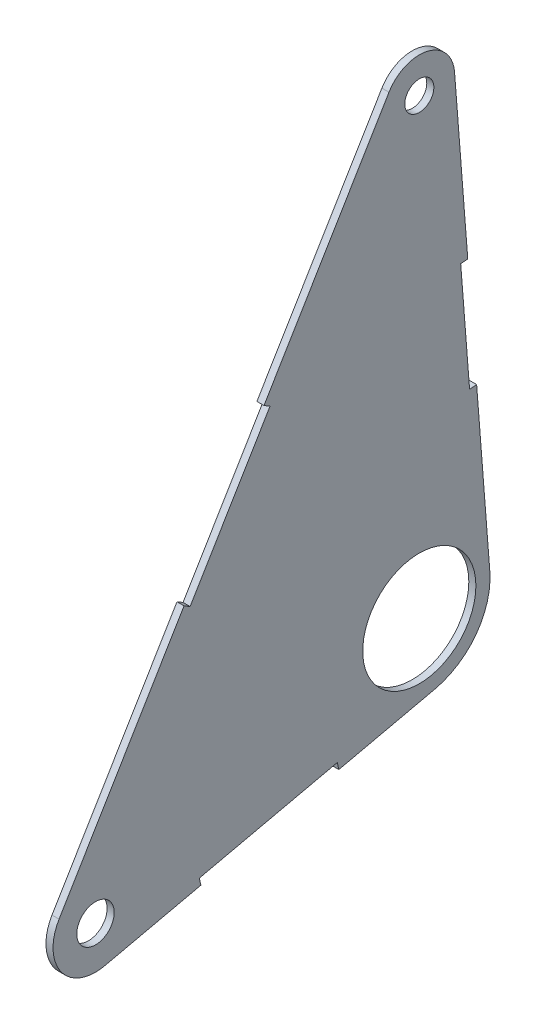
ISO-10303-21;
HEADER;
FILE_DESCRIPTION(('STEP AP214'),'2;1');
FILE_NAME('part.step','',(''),(''),'','','');
FILE_SCHEMA(('AUTOMOTIVE_DESIGN { 1 0 10303 214 1 1 1 1 }'));
ENDSEC;
DATA;
#1=APPLICATION_CONTEXT('core data for automotive mechanical design processes');
#2=APPLICATION_PROTOCOL_DEFINITION('international standard','automotive_design',2000,#1);
#3=PRODUCT_CONTEXT('',#1,'mechanical');
#4=PRODUCT('Part','Part','',(#3));
#5=PRODUCT_RELATED_PRODUCT_CATEGORY('part','',(#4));
#6=PRODUCT_DEFINITION_FORMATION('','',#4);
#7=PRODUCT_DEFINITION_CONTEXT('part definition',#1,'design');
#8=PRODUCT_DEFINITION('design','',#6,#7);
#9=PRODUCT_DEFINITION_SHAPE('','',#8);
#10=(LENGTH_UNIT() NAMED_UNIT(*) SI_UNIT(.MILLI.,.METRE.));
#11=(NAMED_UNIT(*) PLANE_ANGLE_UNIT() SI_UNIT($,.RADIAN.));
#12=(NAMED_UNIT(*) SI_UNIT($,.STERADIAN.) SOLID_ANGLE_UNIT());
#13=UNCERTAINTY_MEASURE_WITH_UNIT(LENGTH_MEASURE(1.E-05),#10,'distance_accuracy_value','');
#14=(GEOMETRIC_REPRESENTATION_CONTEXT(3) GLOBAL_UNCERTAINTY_ASSIGNED_CONTEXT((#13)) GLOBAL_UNIT_ASSIGNED_CONTEXT((#10,
#11,#12)) REPRESENTATION_CONTEXT('',''));
#15=CARTESIAN_POINT('',(0.,0.,0.));
#16=DIRECTION('',(0.,0.,1.));
#17=DIRECTION('',(1.,0.,0.));
#18=AXIS2_PLACEMENT_3D('',#15,#16,#17);
#19=CARTESIAN_POINT('',(1.5875,101.6,0.));
#20=DIRECTION('',(-1.,0.,0.));
#21=DIRECTION('',(0.,0.,1.));
#22=AXIS2_PLACEMENT_3D('',#19,#20,#21);
#23=CYLINDRICAL_SURFACE('',#22,7.93750000000001);
#24=CARTESIAN_POINT('',(0.,101.6,0.));
#25=DIRECTION('',(1.,0.,0.));
#26=DIRECTION('',(0.,0.,-1.));
#27=AXIS2_PLACEMENT_3D('',#24,#25,#26);
#28=CIRCLE('',#27,7.93750000000001);
#29=CARTESIAN_POINT('',(0.,105.676370045191,6.81080857935887));
#30=VERTEX_POINT('',#29);
#31=CARTESIAN_POINT('',(0.,102.2201171875,-7.9132395972678));
#32=VERTEX_POINT('',#31);
#33=EDGE_CURVE('E259',#30,#32,#28,.F.);
#34=ORIENTED_EDGE('',*,*,#33,.F.);
#35=DIRECTION('',(-1.,0.,0.));
#36=VECTOR('',#35,1.);
#37=CARTESIAN_POINT('',(1.5875,105.676370045191,6.81080857935887));
#38=LINE('',#37,#36);
#39=CARTESIAN_POINT('',(1.5875,105.676370045191,6.81080857935887));
#40=VERTEX_POINT('',#39);
#41=EDGE_CURVE('E11',#40,#30,#38,.T.);
#42=ORIENTED_EDGE('',*,*,#41,.F.);
#43=CARTESIAN_POINT('',(1.5875,101.6,0.));
#44=DIRECTION('',(1.,0.,0.));
#45=DIRECTION('',(0.,0.,-1.));
#46=AXIS2_PLACEMENT_3D('',#43,#44,#45);
#47=CIRCLE('',#46,7.93750000000001);
#48=CARTESIAN_POINT('',(1.5875,102.2201171875,-7.9132395972678));
#49=VERTEX_POINT('',#48);
#50=EDGE_CURVE('E368',#40,#49,#47,.F.);
#51=ORIENTED_EDGE('',*,*,#50,.T.);
#52=DIRECTION('',(-1.,0.,0.));
#53=VECTOR('',#52,1.);
#54=CARTESIAN_POINT('',(1.5875,102.2201171875,-7.9132395972678));
#55=LINE('',#54,#53);
#56=EDGE_CURVE('E58',#49,#32,#55,.T.);
#57=ORIENTED_EDGE('',*,*,#56,.T.);
#58=EDGE_LOOP('',(#34,#42,#51,#57));
#59=FACE_BOUND('',#58,.T.);
#60=ADVANCED_FACE('F40',(#59),#23,.T.);
#61=CARTESIAN_POINT('',(1.5875,30.8725838581353,51.5819851183567));
#62=DIRECTION('',(0.,0.513558430890221,0.858054624171197));
#63=DIRECTION('',(0.,-0.858054624171197,0.513558430890222));
#64=AXIS2_PLACEMENT_3D('',#61,#62,#63);
#65=PLANE('',#64);
#66=DIRECTION('',(0.,0.858054624171197,-0.513558430890222));
#67=VECTOR('',#66,1.);
#68=CARTESIAN_POINT('',(0.,30.8725838581353,51.5819851183567));
#69=LINE('',#68,#67);
#70=CARTESIAN_POINT('',(0.,58.8108949631868,34.8604911613817));
#71=VERTEX_POINT('',#70);
#72=EDGE_CURVE('E255',#71,#30,#69,.T.);
#73=ORIENTED_EDGE('',*,*,#72,.F.);
#74=DIRECTION('',(-1.,0.,0.));
#75=VECTOR('',#74,1.);
#76=CARTESIAN_POINT('',(1.5875,58.8108949631868,34.8604911613817));
#77=LINE('',#76,#75);
#78=CARTESIAN_POINT('',(1.5875,58.8108949631868,34.8604911613817));
#79=VERTEX_POINT('',#78);
#80=EDGE_CURVE('E50',#79,#71,#77,.T.);
#81=ORIENTED_EDGE('',*,*,#80,.F.);
#82=DIRECTION('',(0.,0.858054624171197,-0.513558430890222));
#83=VECTOR('',#82,1.);
#84=CARTESIAN_POINT('',(1.5875,30.8725838581353,51.5819851183567));
#85=LINE('',#84,#83);
#86=EDGE_CURVE('E365',#79,#40,#85,.T.);
#87=ORIENTED_EDGE('',*,*,#86,.T.);
#88=ORIENTED_EDGE('',*,*,#41,.T.);
#89=EDGE_LOOP('',(#73,#81,#87,#88));
#90=FACE_BOUND('',#89,.T.);
#91=ADVANCED_FACE('F256',(#90),#65,.T.);
#92=CARTESIAN_POINT('',(1.5875,27.9383111050524,-16.721493956975));
#93=DIRECTION('',(0.,-0.858054624171203,0.51355843089021));
#94=DIRECTION('',(0.,-0.51355843089021,-0.858054624171203));
#95=AXIS2_PLACEMENT_3D('',#92,#93,#94);
#96=PLANE('',#95);
#97=DIRECTION('',(0.,0.51355843089021,0.858054624171203));
#98=VECTOR('',#97,1.);
#99=CARTESIAN_POINT('',(0.,27.9383111050524,-16.721493956975));
#100=LINE('',#99,#98);
#101=CARTESIAN_POINT('',(0.,57.9956209541486,33.4983294455099));
#102=VERTEX_POINT('',#101);
#103=EDGE_CURVE('E247',#102,#71,#100,.T.);
#104=ORIENTED_EDGE('',*,*,#103,.F.);
#105=DIRECTION('',(-1.,0.,0.));
#106=VECTOR('',#105,1.);
#107=CARTESIAN_POINT('',(1.5875,57.9956209541486,33.4983294455099));
#108=LINE('',#107,#106);
#109=CARTESIAN_POINT('',(1.5875,57.9956209541486,33.4983294455099));
#110=VERTEX_POINT('',#109);
#111=EDGE_CURVE('E237',#110,#102,#108,.T.);
#112=ORIENTED_EDGE('',*,*,#111,.F.);
#113=DIRECTION('',(0.,0.51355843089021,0.858054624171203));
#114=VECTOR('',#113,1.);
#115=CARTESIAN_POINT('',(1.5875,27.9383111050524,-16.721493956975));
#116=LINE('',#115,#114);
#117=EDGE_CURVE('E250',#110,#79,#116,.T.);
#118=ORIENTED_EDGE('',*,*,#117,.T.);
#119=ORIENTED_EDGE('',*,*,#80,.T.);
#120=EDGE_LOOP('',(#104,#112,#118,#119));
#121=FACE_BOUND('',#120,.T.);
#122=ADVANCED_FACE('F245',(#121),#96,.T.);
#123=CARTESIAN_POINT('',(1.5875,30.057309849097,50.2198234024849));
#124=DIRECTION('',(0.,0.513558430890221,0.858054624171197));
#125=DIRECTION('',(0.,-0.858054624171197,0.513558430890221));
#126=AXIS2_PLACEMENT_3D('',#123,#124,#125);
#127=PLANE('',#126);
#128=DIRECTION('',(0.,0.858054624171197,-0.513558430890221));
#129=VECTOR('',#128,1.);
#130=CARTESIAN_POINT('',(0.,30.057309849097,50.2198234024849));
#131=LINE('',#130,#129);
#132=CARTESIAN_POINT('',(0.,28.0280632049695,51.4343576443509));
#133=VERTEX_POINT('',#132);
#134=EDGE_CURVE('E265',#133,#102,#131,.T.);
#135=ORIENTED_EDGE('',*,*,#134,.F.);
#136=DIRECTION('',(-1.,0.,0.));
#137=VECTOR('',#136,1.);
#138=CARTESIAN_POINT('',(1.5875,28.0280632049695,51.4343576443509));
#139=LINE('',#138,#137);
#140=CARTESIAN_POINT('',(1.5875,28.0280632049695,51.4343576443509));
#141=VERTEX_POINT('',#140);
#142=EDGE_CURVE('E234',#141,#133,#139,.T.);
#143=ORIENTED_EDGE('',*,*,#142,.F.);
#144=DIRECTION('',(0.,0.858054624171197,-0.513558430890221));
#145=VECTOR('',#144,1.);
#146=CARTESIAN_POINT('',(1.5875,30.057309849097,50.2198234024849));
#147=LINE('',#146,#145);
#148=EDGE_CURVE('E359',#141,#110,#147,.T.);
#149=ORIENTED_EDGE('',*,*,#148,.T.);
#150=ORIENTED_EDGE('',*,*,#111,.T.);
#151=EDGE_LOOP('',(#135,#143,#149,#150));
#152=FACE_BOUND('',#151,.T.);
#153=ADVANCED_FACE('F449',(#152),#127,.T.);
#154=CARTESIAN_POINT('',(1.5875,-2.02924664412764,1.21453424186608));
#155=DIRECTION('',(0.,-0.858054624171195,0.513558430890224));
#156=DIRECTION('',(0.,-0.513558430890224,-0.858054624171195));
#157=AXIS2_PLACEMENT_3D('',#154,#155,#156);
#158=PLANE('',#157);
#159=DIRECTION('',(0.,0.513558430890224,0.858054624171195));
#160=VECTOR('',#159,1.);
#161=CARTESIAN_POINT('',(0.,-2.02924664412764,1.21453424186608));
#162=LINE('',#161,#160);
#163=CARTESIAN_POINT('',(0.,28.8433372140078,52.7965193602226));
#164=VERTEX_POINT('',#163);
#165=EDGE_CURVE('E270',#133,#164,#162,.T.);
#166=ORIENTED_EDGE('',*,*,#165,.T.);
#167=DIRECTION('',(-1.,0.,0.));
#168=VECTOR('',#167,1.);
#169=CARTESIAN_POINT('',(1.5875,28.8433372140078,52.7965193602226));
#170=LINE('',#169,#168);
#171=CARTESIAN_POINT('',(1.5875,28.8433372140078,52.7965193602226));
#172=VERTEX_POINT('',#171);
#173=EDGE_CURVE('E231',#172,#164,#170,.T.);
#174=ORIENTED_EDGE('',*,*,#173,.F.);
#175=DIRECTION('',(0.,0.513558430890224,0.858054624171195));
#176=VECTOR('',#175,1.);
#177=CARTESIAN_POINT('',(1.5875,-2.02924664412764,1.21453424186608));
#178=LINE('',#177,#176);
#179=EDGE_CURVE('E356',#141,#172,#178,.T.);
#180=ORIENTED_EDGE('',*,*,#179,.F.);
#181=ORIENTED_EDGE('',*,*,#142,.T.);
#182=EDGE_LOOP('',(#166,#174,#180,#181));
#183=FACE_BOUND('',#182,.T.);
#184=ADVANCED_FACE('F446',(#183),#158,.F.);
#185=CARTESIAN_POINT('',(0.,-18.0221378679966,80.8462019422454));
#186=VERTEX_POINT('',#185);
#187=EDGE_CURVE('E261',#186,#164,#69,.T.);
#188=ORIENTED_EDGE('',*,*,#187,.F.);
#189=DIRECTION('',(-1.,0.,0.));
#190=VECTOR('',#189,1.);
#191=CARTESIAN_POINT('',(1.5875,-18.0221378679966,80.8462019422454));
#192=LINE('',#191,#190);
#193=CARTESIAN_POINT('',(1.5875,-18.0221378679966,80.8462019422454));
#194=VERTEX_POINT('',#193);
#195=EDGE_CURVE('E228',#194,#186,#192,.T.);
#196=ORIENTED_EDGE('',*,*,#195,.F.);
#197=EDGE_CURVE('E355',#194,#172,#85,.T.);
#198=ORIENTED_EDGE('',*,*,#197,.T.);
#199=ORIENTED_EDGE('',*,*,#173,.T.);
#200=EDGE_LOOP('',(#188,#196,#198,#199));
#201=FACE_BOUND('',#200,.T.);
#202=ADVANCED_FACE('F440',(#201),#65,.T.);
#203=CARTESIAN_POINT('',(1.5875,-22.9137819222259,72.6732316470148));
#204=DIRECTION('',(-1.,0.,0.));
#205=DIRECTION('',(0.,0.,1.));
#206=AXIS2_PLACEMENT_3D('',#203,#204,#205);
#207=CYLINDRICAL_SURFACE('',#206,9.52499999999999);
#208=CARTESIAN_POINT('',(0.,-22.9137819222259,72.6732316470148));
#209=DIRECTION('',(1.,0.,0.));
#210=DIRECTION('',(0.,0.,-1.));
#211=AXIS2_PLACEMENT_3D('',#208,#209,#210);
#212=CIRCLE('',#211,9.52499999999999);
#213=CARTESIAN_POINT('',(0.,-32.2050239534867,70.5759842804572));
#214=VERTEX_POINT('',#213);
#215=EDGE_CURVE('E277',#214,#186,#212,.F.);
#216=ORIENTED_EDGE('',*,*,#215,.F.);
#217=DIRECTION('',(-1.,0.,0.));
#218=VECTOR('',#217,1.);
#219=CARTESIAN_POINT('',(1.5875,-32.2050239534867,70.5759842804572));
#220=LINE('',#219,#218);
#221=CARTESIAN_POINT('',(1.5875,-32.2050239534867,70.5759842804572));
#222=VERTEX_POINT('',#221);
#223=EDGE_CURVE('E225',#222,#214,#220,.T.);
#224=ORIENTED_EDGE('',*,*,#223,.F.);
#225=CARTESIAN_POINT('',(1.5875,-22.9137819222259,72.6732316470148));
#226=DIRECTION('',(1.,0.,0.));
#227=DIRECTION('',(0.,0.,-1.));
#228=AXIS2_PLACEMENT_3D('',#225,#226,#227);
#229=CIRCLE('',#228,9.52499999999999);
#230=EDGE_CURVE('E351',#222,#194,#229,.F.);
#231=ORIENTED_EDGE('',*,*,#230,.T.);
#232=ORIENTED_EDGE('',*,*,#195,.T.);
#233=EDGE_LOOP('',(#216,#224,#231,#232));
#234=FACE_BOUND('',#233,.T.);
#235=ADVANCED_FACE('F463',(#234),#207,.T.);
#236=CARTESIAN_POINT('',(1.5875,-15.4854033854347,-3.49541227759593));
#237=DIRECTION('',(0.,0.975458480972263,0.220183450557224));
#238=DIRECTION('',(0.,-0.220183450557224,0.975458480972263));
#239=AXIS2_PLACEMENT_3D('',#236,#237,#238);
#240=PLANE('',#239);
#241=DIRECTION('',(0.,0.220183450557224,-0.975458480972263));
#242=VECTOR('',#241,1.);
#243=CARTESIAN_POINT('',(0.,-15.4854033854347,-3.49541227759593));
#244=LINE('',#243,#242);
#245=CARTESIAN_POINT('',(0.,-27.3406259470566,49.0256893868653));
#246=VERTEX_POINT('',#245);
#247=EDGE_CURVE('E281',#214,#246,#244,.T.);
#248=ORIENTED_EDGE('',*,*,#247,.T.);
#249=DIRECTION('',(-1.,0.,0.));
#250=VECTOR('',#249,1.);
#251=CARTESIAN_POINT('',(1.5875,-27.3406259470566,49.0256893868653));
#252=LINE('',#251,#250);
#253=CARTESIAN_POINT('',(1.5875,-27.3406259470566,49.0256893868653));
#254=VERTEX_POINT('',#253);
#255=EDGE_CURVE('E221',#254,#246,#252,.T.);
#256=ORIENTED_EDGE('',*,*,#255,.F.);
#257=DIRECTION('',(0.,0.220183450557224,-0.975458480972263));
#258=VECTOR('',#257,1.);
#259=CARTESIAN_POINT('',(1.5875,-15.4854033854347,-3.49541227759593));
#260=LINE('',#259,#258);
#261=EDGE_CURVE('E337',#222,#254,#260,.T.);
#262=ORIENTED_EDGE('',*,*,#261,.F.);
#263=ORIENTED_EDGE('',*,*,#223,.T.);
#264=EDGE_LOOP('',(#248,#256,#262,#263));
#265=FACE_BOUND('',#264,.T.);
#266=ADVANCED_FACE('F466',(#265),#240,.F.);
#267=CARTESIAN_POINT('',(1.5875,-11.8552225616219,52.5211016644612));
#268=DIRECTION('',(0.,-0.220183450557223,0.975458480972263));
#269=DIRECTION('',(0.,-0.975458480972263,-0.220183450557224));
#270=AXIS2_PLACEMENT_3D('',#267,#268,#269);
#271=PLANE('',#270);
#272=DIRECTION('',(0.,0.975458480972263,0.220183450557223));
#273=VECTOR('',#272,1.);
#274=CARTESIAN_POINT('',(0.,-11.8552225616219,52.5211016644612));
#275=LINE('',#274,#273);
#276=CARTESIAN_POINT('',(0.,-25.7920856085134,49.3752306146249));
#277=VERTEX_POINT('',#276);
#278=EDGE_CURVE('E285',#246,#277,#275,.T.);
#279=ORIENTED_EDGE('',*,*,#278,.T.);
#280=DIRECTION('',(-1.,0.,0.));
#281=VECTOR('',#280,1.);
#282=CARTESIAN_POINT('',(1.5875,-25.7920856085134,49.3752306146249));
#283=LINE('',#282,#281);
#284=CARTESIAN_POINT('',(1.5875,-25.7920856085134,49.3752306146249));
#285=VERTEX_POINT('',#284);
#286=EDGE_CURVE('E218',#285,#277,#283,.T.);
#287=ORIENTED_EDGE('',*,*,#286,.F.);
#288=DIRECTION('',(0.,0.975458480972263,0.220183450557223));
#289=VECTOR('',#288,1.);
#290=CARTESIAN_POINT('',(1.5875,-11.8552225616219,52.5211016644612));
#291=LINE('',#290,#289);
#292=EDGE_CURVE('E346',#254,#285,#291,.T.);
#293=ORIENTED_EDGE('',*,*,#292,.F.);
#294=ORIENTED_EDGE('',*,*,#255,.T.);
#295=EDGE_LOOP('',(#279,#287,#293,#294));
#296=FACE_BOUND('',#295,.T.);
#297=ADVANCED_FACE('F468',(#296),#271,.F.);
#298=CARTESIAN_POINT('',(1.5875,-13.9368630468914,-3.1458710498364));
#299=DIRECTION('',(0.,-0.975458480972263,-0.220183450557224));
#300=DIRECTION('',(0.,0.220183450557224,-0.975458480972263));
#301=AXIS2_PLACEMENT_3D('',#298,#299,#300);
#302=PLANE('',#301);
#303=DIRECTION('',(0.,-0.220183450557224,0.975458480972263));
#304=VECTOR('',#303,1.);
#305=CARTESIAN_POINT('',(0.,-13.9368630468914,-3.1458710498364));
#306=LINE('',#305,#304);
#307=CARTESIAN_POINT('',(0.,-18.8012610533215,18.4044238437555));
#308=VERTEX_POINT('',#307);
#309=EDGE_CURVE('E290',#308,#277,#306,.T.);
#310=ORIENTED_EDGE('',*,*,#309,.F.);
#311=DIRECTION('',(-1.,0.,0.));
#312=VECTOR('',#311,1.);
#313=CARTESIAN_POINT('',(1.5875,-18.8012610533215,18.4044238437555));
#314=LINE('',#313,#312);
#315=CARTESIAN_POINT('',(1.5875,-18.8012610533215,18.4044238437555));
#316=VERTEX_POINT('',#315);
#317=EDGE_CURVE('E215',#316,#308,#314,.T.);
#318=ORIENTED_EDGE('',*,*,#317,.F.);
#319=DIRECTION('',(0.,-0.220183450557224,0.975458480972263));
#320=VECTOR('',#319,1.);
#321=CARTESIAN_POINT('',(1.5875,-13.9368630468914,-3.1458710498364));
#322=LINE('',#321,#320);
#323=EDGE_CURVE('E342',#316,#285,#322,.T.);
#324=ORIENTED_EDGE('',*,*,#323,.T.);
#325=ORIENTED_EDGE('',*,*,#286,.T.);
#326=EDGE_LOOP('',(#310,#318,#324,#325));
#327=FACE_BOUND('',#326,.T.);
#328=ADVANCED_FACE('F471',(#327),#302,.T.);
#329=CARTESIAN_POINT('',(1.5875,-4.86439800642992,21.5502948935918));
#330=DIRECTION('',(0.,-0.220183450557218,0.975458480972264));
#331=DIRECTION('',(0.,-0.975458480972264,-0.220183450557218));
#332=AXIS2_PLACEMENT_3D('',#329,#330,#331);
#333=PLANE('',#332);
#334=DIRECTION('',(0.,0.975458480972264,0.220183450557218));
#335=VECTOR('',#334,1.);
#336=CARTESIAN_POINT('',(0.,-4.86439800642992,21.5502948935918));
#337=LINE('',#336,#335);
#338=CARTESIAN_POINT('',(0.,-20.3498013918647,18.054882615996));
#339=VERTEX_POINT('',#338);
#340=EDGE_CURVE('E294',#339,#308,#337,.T.);
#341=ORIENTED_EDGE('',*,*,#340,.F.);
#342=DIRECTION('',(-1.,0.,0.));
#343=VECTOR('',#342,1.);
#344=CARTESIAN_POINT('',(1.5875,-20.3498013918647,18.054882615996));
#345=LINE('',#344,#343);
#346=CARTESIAN_POINT('',(1.5875,-20.3498013918647,18.054882615996));
#347=VERTEX_POINT('',#346);
#348=EDGE_CURVE('E212',#347,#339,#345,.T.);
#349=ORIENTED_EDGE('',*,*,#348,.F.);
#350=DIRECTION('',(0.,0.975458480972264,0.220183450557218));
#351=VECTOR('',#350,1.);
#352=CARTESIAN_POINT('',(1.5875,-4.86439800642992,21.5502948935918));
#353=LINE('',#352,#351);
#354=EDGE_CURVE('E335',#347,#316,#353,.T.);
#355=ORIENTED_EDGE('',*,*,#354,.T.);
#356=ORIENTED_EDGE('',*,*,#317,.T.);
#357=EDGE_LOOP('',(#341,#349,#355,#356));
#358=FACE_BOUND('',#357,.T.);
#359=ADVANCED_FACE('F475',(#358),#333,.T.);
#360=CARTESIAN_POINT('',(0.,-15.4854033854347,-3.49541227759593));
#361=VERTEX_POINT('',#360);
#362=EDGE_CURVE('E286',#339,#361,#244,.T.);
#363=ORIENTED_EDGE('',*,*,#362,.T.);
#364=DIRECTION('',(-1.,0.,0.));
#365=VECTOR('',#364,1.);
#366=CARTESIAN_POINT('',(1.5875,-15.4854033854347,-3.49541227759593));
#367=LINE('',#366,#365);
#368=CARTESIAN_POINT('',(1.5875,-15.4854033854347,-3.49541227759593));
#369=VERTEX_POINT('',#368);
#370=EDGE_CURVE('E208',#369,#361,#367,.T.);
#371=ORIENTED_EDGE('',*,*,#370,.F.);
#372=EDGE_CURVE('E330',#347,#369,#260,.T.);
#373=ORIENTED_EDGE('',*,*,#372,.F.);
#374=ORIENTED_EDGE('',*,*,#348,.T.);
#375=EDGE_LOOP('',(#363,#371,#373,#374));
#376=FACE_BOUND('',#375,.T.);
#377=ADVANCED_FACE('F479',(#376),#240,.F.);
#378=CARTESIAN_POINT('',(1.5875,0.,0.));
#379=DIRECTION('',(-1.,0.,0.));
#380=DIRECTION('',(0.,0.,1.));
#381=AXIS2_PLACEMENT_3D('',#378,#379,#380);
#382=CYLINDRICAL_SURFACE('',#381,15.875);
#383=CARTESIAN_POINT('',(0.,0.,0.));
#384=DIRECTION('',(1.,0.,0.));
#385=DIRECTION('',(0.,0.,-1.));
#386=AXIS2_PLACEMENT_3D('',#383,#384,#385);
#387=CIRCLE('',#386,15.875);
#388=CARTESIAN_POINT('',(0.,1.240234375,-15.8264791945356));
#389=VERTEX_POINT('',#388);
#390=EDGE_CURVE('E298',#361,#389,#387,.T.);
#391=ORIENTED_EDGE('',*,*,#390,.T.);
#392=DIRECTION('',(-1.,0.,0.));
#393=VECTOR('',#392,1.);
#394=CARTESIAN_POINT('',(1.5875,1.240234375,-15.8264791945356));
#395=LINE('',#394,#393);
#396=CARTESIAN_POINT('',(1.5875,1.240234375,-15.8264791945356));
#397=VERTEX_POINT('',#396);
#398=EDGE_CURVE('E205',#397,#389,#395,.T.);
#399=ORIENTED_EDGE('',*,*,#398,.F.);
#400=CARTESIAN_POINT('',(1.5875,0.,0.));
#401=DIRECTION('',(1.,0.,0.));
#402=DIRECTION('',(0.,0.,-1.));
#403=AXIS2_PLACEMENT_3D('',#400,#401,#402);
#404=CIRCLE('',#403,15.875);
#405=EDGE_CURVE('E325',#369,#397,#404,.T.);
#406=ORIENTED_EDGE('',*,*,#405,.F.);
#407=ORIENTED_EDGE('',*,*,#370,.T.);
#408=EDGE_LOOP('',(#391,#399,#406,#407));
#409=FACE_BOUND('',#408,.T.);
#410=ADVANCED_FACE('F483',(#409),#382,.T.);
#411=CARTESIAN_POINT('',(1.5875,1.240234375,-15.8264791945356));
#412=DIRECTION('',(0.,0.0781250000000002,-0.996943571309329));
#413=DIRECTION('',(0.,0.996943571309329,0.0781250000000002));
#414=AXIS2_PLACEMENT_3D('',#411,#412,#413);
#415=PLANE('',#414);
#416=DIRECTION('',(0.,-0.996943571309329,-0.0781250000000002));
#417=VECTOR('',#416,1.);
#418=CARTESIAN_POINT('',(0.,1.240234375,-15.8264791945356));
#419=LINE('',#418,#417);
#420=CARTESIAN_POINT('',(0.,39.03017578125,-12.8650887434333));
#421=VERTEX_POINT('',#420);
#422=EDGE_CURVE('E302',#421,#389,#419,.T.);
#423=ORIENTED_EDGE('',*,*,#422,.F.);
#424=DIRECTION('',(-1.,0.,0.));
#425=VECTOR('',#424,1.);
#426=CARTESIAN_POINT('',(1.5875,39.03017578125,-12.8650887434333));
#427=LINE('',#426,#425);
#428=CARTESIAN_POINT('',(1.5875,39.03017578125,-12.8650887434333));
#429=VERTEX_POINT('',#428);
#430=EDGE_CURVE('E198',#429,#421,#427,.T.);
#431=ORIENTED_EDGE('',*,*,#430,.F.);
#432=DIRECTION('',(0.,-0.996943571309329,-0.0781250000000002));
#433=VECTOR('',#432,1.);
#434=CARTESIAN_POINT('',(1.5875,1.240234375,-15.8264791945356));
#435=LINE('',#434,#433);
#436=EDGE_CURVE('E319',#429,#397,#435,.T.);
#437=ORIENTED_EDGE('',*,*,#436,.T.);
#438=ORIENTED_EDGE('',*,*,#398,.T.);
#439=EDGE_LOOP('',(#423,#431,#437,#438));
#440=FACE_BOUND('',#439,.T.);
#441=ADVANCED_FACE('F487',(#440),#415,.T.);
#442=CARTESIAN_POINT('',(1.5875,37.78994140625,2.96139045110237));
#443=DIRECTION('',(0.,0.996943571309329,0.0781250000000016));
#444=DIRECTION('',(0.,-0.0781250000000016,0.996943571309329));
#445=AXIS2_PLACEMENT_3D('',#442,#443,#444);
#446=PLANE('',#445);
#447=DIRECTION('',(0.,0.0781250000000016,-0.996943571309329));
#448=VECTOR('',#447,1.);
#449=CARTESIAN_POINT('',(0.,37.78994140625,2.96139045110237));
#450=LINE('',#449,#448);
#451=CARTESIAN_POINT('',(0.,38.90615234375,-11.2824408239797));
#452=VERTEX_POINT('',#451);
#453=EDGE_CURVE('E306',#452,#421,#450,.T.);
#454=ORIENTED_EDGE('',*,*,#453,.F.);
#455=DIRECTION('',(-1.,0.,0.));
#456=VECTOR('',#455,1.);
#457=CARTESIAN_POINT('',(1.5875,38.90615234375,-11.2824408239797));
#458=LINE('',#457,#456);
#459=CARTESIAN_POINT('',(1.5875,38.90615234375,-11.2824408239797));
#460=VERTEX_POINT('',#459);
#461=EDGE_CURVE('E193',#460,#452,#458,.T.);
#462=ORIENTED_EDGE('',*,*,#461,.F.);
#463=DIRECTION('',(0.,0.0781250000000016,-0.996943571309329));
#464=VECTOR('',#463,1.);
#465=CARTESIAN_POINT('',(1.5875,37.78994140625,2.96139045110237));
#466=LINE('',#465,#464);
#467=EDGE_CURVE('E185',#460,#429,#466,.T.);
#468=ORIENTED_EDGE('',*,*,#467,.T.);
#469=ORIENTED_EDGE('',*,*,#430,.T.);
#470=EDGE_LOOP('',(#454,#462,#468,#469));
#471=FACE_BOUND('',#470,.T.);
#472=ADVANCED_FACE('F489',(#471),#446,.T.);
#473=CARTESIAN_POINT('',(1.5875,1.11621093750001,-14.2438312750821));
#474=DIRECTION('',(0.,-0.0781250000000003,0.996943571309329));
#475=DIRECTION('',(0.,-0.996943571309329,-0.0781250000000003));
#476=AXIS2_PLACEMENT_3D('',#473,#474,#475);
#477=PLANE('',#476);
#478=DIRECTION('',(0.,0.996943571309329,0.0781250000000003));
#479=VECTOR('',#478,1.);
#480=CARTESIAN_POINT('',(0.,1.11621093750001,-14.2438312750821));
#481=LINE('',#480,#479);
#482=CARTESIAN_POINT('',(0.,64.30615234375,-9.29198212891655));
#483=VERTEX_POINT('',#482);
#484=EDGE_CURVE('E191',#452,#483,#481,.T.);
#485=ORIENTED_EDGE('',*,*,#484,.T.);
#486=DIRECTION('',(-1.,0.,0.));
#487=VECTOR('',#486,1.);
#488=CARTESIAN_POINT('',(1.5875,64.30615234375,-9.29198212891655));
#489=LINE('',#488,#487);
#490=CARTESIAN_POINT('',(1.5875,64.30615234375,-9.29198212891655));
#491=VERTEX_POINT('',#490);
#492=EDGE_CURVE('E172',#491,#483,#489,.T.);
#493=ORIENTED_EDGE('',*,*,#492,.F.);
#494=DIRECTION('',(0.,0.996943571309329,0.0781250000000003));
#495=VECTOR('',#494,1.);
#496=CARTESIAN_POINT('',(1.5875,1.11621093750001,-14.2438312750821));
#497=LINE('',#496,#495);
#498=EDGE_CURVE('E178',#460,#491,#497,.T.);
#499=ORIENTED_EDGE('',*,*,#498,.F.);
#500=ORIENTED_EDGE('',*,*,#461,.T.);
#501=EDGE_LOOP('',(#485,#493,#499,#500));
#502=FACE_BOUND('',#501,.T.);
#503=ADVANCED_FACE('F189',(#502),#477,.F.);
#504=CARTESIAN_POINT('',(1.5875,63.18994140625,4.95184914616532));
#505=DIRECTION('',(0.,0.99694357130933,0.0781249999999973));
#506=DIRECTION('',(0.,-0.0781249999999973,0.99694357130933));
#507=AXIS2_PLACEMENT_3D('',#504,#505,#506);
#508=PLANE('',#507);
#509=DIRECTION('',(0.,0.0781249999999973,-0.99694357130933));
#510=VECTOR('',#509,1.);
#511=CARTESIAN_POINT('',(0.,63.18994140625,4.95184914616532));
#512=LINE('',#511,#510);
#513=CARTESIAN_POINT('',(0.,64.43017578125,-10.8746300483701));
#514=VERTEX_POINT('',#513);
#515=EDGE_CURVE('E313',#483,#514,#512,.T.);
#516=ORIENTED_EDGE('',*,*,#515,.T.);
#517=DIRECTION('',(-1.,0.,0.));
#518=VECTOR('',#517,1.);
#519=CARTESIAN_POINT('',(1.5875,64.43017578125,-10.8746300483701));
#520=LINE('',#519,#518);
#521=CARTESIAN_POINT('',(1.5875,64.43017578125,-10.8746300483701));
#522=VERTEX_POINT('',#521);
#523=EDGE_CURVE('E114',#522,#514,#520,.T.);
#524=ORIENTED_EDGE('',*,*,#523,.F.);
#525=DIRECTION('',(0.,0.0781249999999973,-0.99694357130933));
#526=VECTOR('',#525,1.);
#527=CARTESIAN_POINT('',(1.5875,63.18994140625,4.95184914616532));
#528=LINE('',#527,#526);
#529=EDGE_CURVE('E168',#491,#522,#528,.T.);
#530=ORIENTED_EDGE('',*,*,#529,.F.);
#531=ORIENTED_EDGE('',*,*,#492,.T.);
#532=EDGE_LOOP('',(#516,#524,#530,#531));
#533=FACE_BOUND('',#532,.T.);
#534=ADVANCED_FACE('F170',(#533),#508,.F.);
#535=CARTESIAN_POINT('',(1.5875,0.,0.));
#536=DIRECTION('',(-1.,0.,0.));
#537=DIRECTION('',(0.,0.,1.));
#538=AXIS2_PLACEMENT_3D('',#535,#536,#537);
#539=CYLINDRICAL_SURFACE('',#538,12.7);
#540=CARTESIAN_POINT('',(1.5875,0.,0.));
#541=DIRECTION('',(1.,0.,0.));
#542=DIRECTION('',(0.,0.,-1.));
#543=AXIS2_PLACEMENT_3D('',#540,#541,#542);
#544=CIRCLE('',#543,12.7);
#545=CARTESIAN_POINT('',(1.5875,0.,-12.7));
#546=VERTEX_POINT('',#545);
#547=EDGE_CURVE('E371',#546,#546,#544,.T.);
#548=ORIENTED_EDGE('',*,*,#547,.T.);
#549=EDGE_LOOP('',(#548));
#550=FACE_BOUND('',#549,.T.);
#551=CARTESIAN_POINT('',(0.,0.,0.));
#552=DIRECTION('',(1.,0.,0.));
#553=DIRECTION('',(0.,0.,-1.));
#554=AXIS2_PLACEMENT_3D('',#551,#552,#553);
#555=CIRCLE('',#554,12.7);
#556=CARTESIAN_POINT('',(0.,0.,-12.7));
#557=VERTEX_POINT('',#556);
#558=EDGE_CURVE('E379',#557,#557,#555,.T.);
#559=ORIENTED_EDGE('',*,*,#558,.F.);
#560=EDGE_LOOP('',(#559));
#561=FACE_BOUND('',#560,.T.);
#562=ADVANCED_FACE('F42',(#550,#561),#539,.F.);
#563=EDGE_CURVE('E307',#32,#514,#419,.T.);
#564=ORIENTED_EDGE('',*,*,#563,.F.);
#565=ORIENTED_EDGE('',*,*,#56,.F.);
#566=EDGE_CURVE('E177',#49,#522,#435,.T.);
#567=ORIENTED_EDGE('',*,*,#566,.T.);
#568=ORIENTED_EDGE('',*,*,#523,.T.);
#569=EDGE_LOOP('',(#564,#565,#567,#568));
#570=FACE_BOUND('',#569,.T.);
#571=ADVANCED_FACE('F398',(#570),#415,.T.);
#572=CARTESIAN_POINT('',(1.5875,0.,0.));
#573=DIRECTION('',(1.,0.,0.));
#574=DIRECTION('',(0.,0.,-1.));
#575=AXIS2_PLACEMENT_3D('',#572,#573,#574);
#576=PLANE('',#575);
#577=CARTESIAN_POINT('',(1.5875,-22.9137819222259,72.6732316470148));
#578=DIRECTION('',(1.,0.,0.));
#579=DIRECTION('',(0.,0.,-1.));
#580=AXIS2_PLACEMENT_3D('',#577,#578,#579);
#581=CIRCLE('',#580,4.2);
#582=CARTESIAN_POINT('',(1.5875,-22.9137819222259,68.4732316470148));
#583=VERTEX_POINT('',#582);
#584=EDGE_CURVE('E388',#583,#583,#581,.T.);
#585=ORIENTED_EDGE('',*,*,#584,.F.);
#586=EDGE_LOOP('',(#585));
#587=FACE_BOUND('',#586,.T.);
#588=CARTESIAN_POINT('',(1.5875,101.6,0.));
#589=DIRECTION('',(1.,0.,0.));
#590=DIRECTION('',(0.,0.,-1.));
#591=AXIS2_PLACEMENT_3D('',#588,#589,#590);
#592=CIRCLE('',#591,3.26389999999999);
#593=CARTESIAN_POINT('',(1.5875,101.6,-3.26389999999999));
#594=VERTEX_POINT('',#593);
#595=EDGE_CURVE('E380',#594,#594,#592,.T.);
#596=ORIENTED_EDGE('',*,*,#595,.F.);
#597=EDGE_LOOP('',(#596));
#598=FACE_BOUND('',#597,.T.);
#599=ORIENTED_EDGE('',*,*,#547,.F.);
#600=EDGE_LOOP('',(#599));
#601=FACE_BOUND('',#600,.T.);
#602=ORIENTED_EDGE('',*,*,#50,.F.);
#603=ORIENTED_EDGE('',*,*,#86,.F.);
#604=ORIENTED_EDGE('',*,*,#117,.F.);
#605=ORIENTED_EDGE('',*,*,#148,.F.);
#606=ORIENTED_EDGE('',*,*,#179,.T.);
#607=ORIENTED_EDGE('',*,*,#197,.F.);
#608=ORIENTED_EDGE('',*,*,#230,.F.);
#609=ORIENTED_EDGE('',*,*,#261,.T.);
#610=ORIENTED_EDGE('',*,*,#292,.T.);
#611=ORIENTED_EDGE('',*,*,#323,.F.);
#612=ORIENTED_EDGE('',*,*,#354,.F.);
#613=ORIENTED_EDGE('',*,*,#372,.T.);
#614=ORIENTED_EDGE('',*,*,#405,.T.);
#615=ORIENTED_EDGE('',*,*,#436,.F.);
#616=ORIENTED_EDGE('',*,*,#467,.F.);
#617=ORIENTED_EDGE('',*,*,#498,.T.);
#618=ORIENTED_EDGE('',*,*,#529,.T.);
#619=ORIENTED_EDGE('',*,*,#566,.F.);
#620=EDGE_LOOP('',(#602,#603,#604,#605,#606,#607,#608,#609,#610,#611,#612,#613,#614,#615,#616,
#617,#618,#619));
#621=FACE_BOUND('',#620,.T.);
#622=ADVANCED_FACE('F182',(#587,#598,#601,#621),#576,.T.);
#623=CARTESIAN_POINT('',(0.,0.,0.));
#624=DIRECTION('',(1.,0.,0.));
#625=DIRECTION('',(0.,0.,-1.));
#626=AXIS2_PLACEMENT_3D('',#623,#624,#625);
#627=PLANE('',#626);
#628=CARTESIAN_POINT('',(0.,-22.9137819222259,72.6732316470148));
#629=DIRECTION('',(1.,0.,0.));
#630=DIRECTION('',(0.,0.,-1.));
#631=AXIS2_PLACEMENT_3D('',#628,#629,#630);
#632=CIRCLE('',#631,4.2);
#633=CARTESIAN_POINT('',(0.,-22.9137819222259,68.4732316470148));
#634=VERTEX_POINT('',#633);
#635=EDGE_CURVE('E384',#634,#634,#632,.T.);
#636=ORIENTED_EDGE('',*,*,#635,.T.);
#637=EDGE_LOOP('',(#636));
#638=FACE_BOUND('',#637,.T.);
#639=CARTESIAN_POINT('',(0.,101.6,0.));
#640=DIRECTION('',(1.,0.,0.));
#641=DIRECTION('',(0.,0.,-1.));
#642=AXIS2_PLACEMENT_3D('',#639,#640,#641);
#643=CIRCLE('',#642,3.2639);
#644=CARTESIAN_POINT('',(0.,101.6,-3.2639));
#645=VERTEX_POINT('',#644);
#646=EDGE_CURVE('E375',#645,#645,#643,.T.);
#647=ORIENTED_EDGE('',*,*,#646,.T.);
#648=EDGE_LOOP('',(#647));
#649=FACE_BOUND('',#648,.T.);
#650=ORIENTED_EDGE('',*,*,#558,.T.);
#651=EDGE_LOOP('',(#650));
#652=FACE_BOUND('',#651,.T.);
#653=ORIENTED_EDGE('',*,*,#33,.T.);
#654=ORIENTED_EDGE('',*,*,#563,.T.);
#655=ORIENTED_EDGE('',*,*,#515,.F.);
#656=ORIENTED_EDGE('',*,*,#484,.F.);
#657=ORIENTED_EDGE('',*,*,#453,.T.);
#658=ORIENTED_EDGE('',*,*,#422,.T.);
#659=ORIENTED_EDGE('',*,*,#390,.F.);
#660=ORIENTED_EDGE('',*,*,#362,.F.);
#661=ORIENTED_EDGE('',*,*,#340,.T.);
#662=ORIENTED_EDGE('',*,*,#309,.T.);
#663=ORIENTED_EDGE('',*,*,#278,.F.);
#664=ORIENTED_EDGE('',*,*,#247,.F.);
#665=ORIENTED_EDGE('',*,*,#215,.T.);
#666=ORIENTED_EDGE('',*,*,#187,.T.);
#667=ORIENTED_EDGE('',*,*,#165,.F.);
#668=ORIENTED_EDGE('',*,*,#134,.T.);
#669=ORIENTED_EDGE('',*,*,#103,.T.);
#670=ORIENTED_EDGE('',*,*,#72,.T.);
#671=EDGE_LOOP('',(#653,#654,#655,#656,#657,#658,#659,#660,#661,#662,#663,#664,#665,#666,#667,
#668,#669,#670));
#672=FACE_BOUND('',#671,.T.);
#673=ADVANCED_FACE('F262',(#638,#649,#652,#672),#627,.F.);
#674=CARTESIAN_POINT('',(1.5875,101.6,0.));
#675=DIRECTION('',(1.,0.,0.));
#676=DIRECTION('',(0.,0.,-1.));
#677=AXIS2_PLACEMENT_3D('',#674,#675,#676);
#678=CYLINDRICAL_SURFACE('',#677,3.26389999999999);
#679=ORIENTED_EDGE('',*,*,#646,.F.);
#680=EDGE_LOOP('',(#679));
#681=FACE_BOUND('',#680,.T.);
#682=ORIENTED_EDGE('',*,*,#595,.T.);
#683=EDGE_LOOP('',(#682));
#684=FACE_BOUND('',#683,.T.);
#685=ADVANCED_FACE('F500',(#681,#684),#678,.F.);
#686=CARTESIAN_POINT('',(1.5875,-22.9137819222259,72.6732316470148));
#687=DIRECTION('',(1.,0.,0.));
#688=DIRECTION('',(0.,0.,-1.));
#689=AXIS2_PLACEMENT_3D('',#686,#687,#688);
#690=CYLINDRICAL_SURFACE('',#689,4.2);
#691=ORIENTED_EDGE('',*,*,#635,.F.);
#692=EDGE_LOOP('',(#691));
#693=FACE_BOUND('',#692,.T.);
#694=ORIENTED_EDGE('',*,*,#584,.T.);
#695=EDGE_LOOP('',(#694));
#696=FACE_BOUND('',#695,.T.);
#697=ADVANCED_FACE('F394',(#693,#696),#690,.F.);
#698=CLOSED_SHELL('',(#60,#91,#122,#153,#184,#202,#235,#266,#297,#328,#359,#377,#410,#441,#472,
#503,#534,#562,#571,#622,#673,#685,#697));
#699=MANIFOLD_SOLID_BREP('B2',#698);
#700=ADVANCED_BREP_SHAPE_REPRESENTATION('',(#18,#699),#14);
#701=SHAPE_DEFINITION_REPRESENTATION(#9,#700);
ENDSEC;
END-ISO-10303-21;
